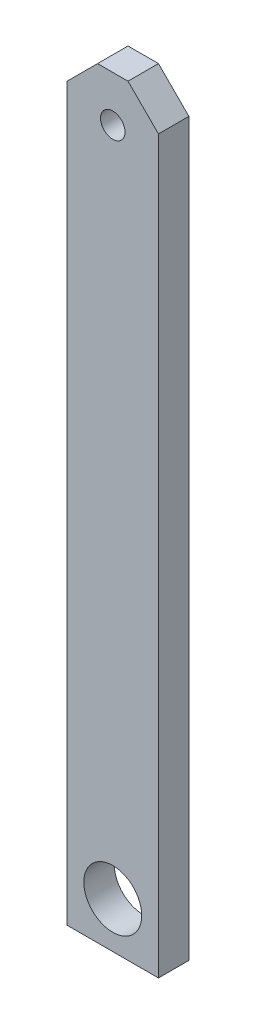
ISO-10303-21;
HEADER;
FILE_DESCRIPTION(('STEP AP214'),'2;1');
FILE_NAME('part.step','',(''),(''),'','','');
FILE_SCHEMA(('AUTOMOTIVE_DESIGN { 1 0 10303 214 1 1 1 1 }'));
ENDSEC;
DATA;
#1=APPLICATION_CONTEXT('core data for automotive mechanical design processes');
#2=APPLICATION_PROTOCOL_DEFINITION('international standard','automotive_design',2000,#1);
#3=PRODUCT_CONTEXT('',#1,'mechanical');
#4=PRODUCT('Part','Part','',(#3));
#5=PRODUCT_RELATED_PRODUCT_CATEGORY('part','',(#4));
#6=PRODUCT_DEFINITION_FORMATION('','',#4);
#7=PRODUCT_DEFINITION_CONTEXT('part definition',#1,'design');
#8=PRODUCT_DEFINITION('design','',#6,#7);
#9=PRODUCT_DEFINITION_SHAPE('','',#8);
#10=(LENGTH_UNIT() NAMED_UNIT(*) SI_UNIT(.MILLI.,.METRE.));
#11=(NAMED_UNIT(*) PLANE_ANGLE_UNIT() SI_UNIT($,.RADIAN.));
#12=(NAMED_UNIT(*) SI_UNIT($,.STERADIAN.) SOLID_ANGLE_UNIT());
#13=UNCERTAINTY_MEASURE_WITH_UNIT(LENGTH_MEASURE(1.E-05),#10,'distance_accuracy_value','');
#14=(GEOMETRIC_REPRESENTATION_CONTEXT(3) GLOBAL_UNCERTAINTY_ASSIGNED_CONTEXT((#13)) GLOBAL_UNIT_ASSIGNED_CONTEXT((#10,
#11,#12)) REPRESENTATION_CONTEXT('',''));
#15=CARTESIAN_POINT('',(0.,0.,0.));
#16=DIRECTION('',(0.,0.,1.));
#17=DIRECTION('',(1.,0.,0.));
#18=AXIS2_PLACEMENT_3D('',#15,#16,#17);
#19=CARTESIAN_POINT('',(0.,0.,6.35));
#20=DIRECTION('',(0.,0.,-1.));
#21=DIRECTION('',(-1.,0.,0.));
#22=AXIS2_PLACEMENT_3D('',#19,#20,#21);
#23=PLANE('',#22);
#24=DIRECTION('',(-1.,0.,0.));
#25=VECTOR('',#24,1.);
#26=CARTESIAN_POINT('',(0.,158.75,6.35));
#27=LINE('',#26,#25);
#28=CARTESIAN_POINT('',(12.7,158.75,6.35));
#29=VERTEX_POINT('',#28);
#30=CARTESIAN_POINT('',(6.35000000000003,158.75,6.35));
#31=VERTEX_POINT('',#30);
#32=EDGE_CURVE('E126',#29,#31,#27,.T.);
#33=ORIENTED_EDGE('',*,*,#32,.T.);
#34=DIRECTION('',(0.707106781186549,0.707106781186546,0.));
#35=VECTOR('',#34,1.);
#36=CARTESIAN_POINT('',(0.,152.4,6.35));
#37=LINE('',#36,#35);
#38=CARTESIAN_POINT('',(0.,152.4,6.35));
#39=VERTEX_POINT('',#38);
#40=EDGE_CURVE('E52',#31,#39,#37,.F.);
#41=ORIENTED_EDGE('',*,*,#40,.T.);
#42=DIRECTION('',(0.,-1.,0.));
#43=VECTOR('',#42,1.);
#44=CARTESIAN_POINT('',(0.,0.,6.35));
#45=LINE('',#44,#43);
#46=CARTESIAN_POINT('',(0.,0.,6.35));
#47=VERTEX_POINT('',#46);
#48=EDGE_CURVE('E98',#39,#47,#45,.T.);
#49=ORIENTED_EDGE('',*,*,#48,.T.);
#50=DIRECTION('',(1.,0.,0.));
#51=VECTOR('',#50,1.);
#52=CARTESIAN_POINT('',(0.,0.,6.35));
#53=LINE('',#52,#51);
#54=CARTESIAN_POINT('',(19.05,0.,6.35));
#55=VERTEX_POINT('',#54);
#56=EDGE_CURVE('E101',#47,#55,#53,.T.);
#57=ORIENTED_EDGE('',*,*,#56,.T.);
#58=DIRECTION('',(0.,1.,0.));
#59=VECTOR('',#58,1.);
#60=CARTESIAN_POINT('',(19.05,0.,6.35));
#61=LINE('',#60,#59);
#62=CARTESIAN_POINT('',(19.05,152.4,6.35));
#63=VERTEX_POINT('',#62);
#64=EDGE_CURVE('E116',#55,#63,#61,.T.);
#65=ORIENTED_EDGE('',*,*,#64,.T.);
#66=DIRECTION('',(0.707106781186545,-0.70710678118655,0.));
#67=VECTOR('',#66,1.);
#68=CARTESIAN_POINT('',(12.7,158.75,6.35));
#69=LINE('',#68,#67);
#70=EDGE_CURVE('E137',#63,#29,#69,.F.);
#71=ORIENTED_EDGE('',*,*,#70,.T.);
#72=EDGE_LOOP('',(#33,#41,#49,#57,#65,#71));
#73=FACE_BOUND('',#72,.T.);
#74=CARTESIAN_POINT('',(9.52499999999998,149.225,6.35));
#75=DIRECTION('',(0.,0.,1.));
#76=DIRECTION('',(1.,0.,0.));
#77=AXIS2_PLACEMENT_3D('',#74,#75,#76);
#78=CIRCLE('',#77,2.5527);
#79=CARTESIAN_POINT('',(12.0777,149.225,6.35));
#80=VERTEX_POINT('',#79);
#81=EDGE_CURVE('E158',#80,#80,#78,.T.);
#82=ORIENTED_EDGE('',*,*,#81,.F.);
#83=EDGE_LOOP('',(#82));
#84=FACE_BOUND('',#83,.T.);
#85=CARTESIAN_POINT('',(9.525,9.52499999999998,6.35));
#86=DIRECTION('',(0.,0.,1.));
#87=DIRECTION('',(1.,0.,0.));
#88=AXIS2_PLACEMENT_3D('',#85,#86,#87);
#89=CIRCLE('',#88,6.0325);
#90=CARTESIAN_POINT('',(15.5575,9.52499999999998,6.35));
#91=VERTEX_POINT('',#90);
#92=EDGE_CURVE('E164',#91,#91,#89,.T.);
#93=ORIENTED_EDGE('',*,*,#92,.F.);
#94=EDGE_LOOP('',(#93));
#95=FACE_BOUND('',#94,.T.);
#96=ADVANCED_FACE('F43',(#73,#84,#95),#23,.F.);
#97=CARTESIAN_POINT('',(0.,0.,6.35));
#98=DIRECTION('',(1.,0.,0.));
#99=DIRECTION('',(0.,1.,0.));
#100=AXIS2_PLACEMENT_3D('',#97,#98,#99);
#101=PLANE('',#100);
#102=ORIENTED_EDGE('',*,*,#48,.F.);
#103=DIRECTION('',(0.,0.,-1.));
#104=VECTOR('',#103,1.);
#105=CARTESIAN_POINT('',(0.,152.4,6.35));
#106=LINE('',#105,#104);
#107=CARTESIAN_POINT('',(0.,152.4,0.));
#108=VERTEX_POINT('',#107);
#109=EDGE_CURVE('E122',#39,#108,#106,.T.);
#110=ORIENTED_EDGE('',*,*,#109,.T.);
#111=DIRECTION('',(0.,-1.,0.));
#112=VECTOR('',#111,1.);
#113=CARTESIAN_POINT('',(0.,0.,0.));
#114=LINE('',#113,#112);
#115=CARTESIAN_POINT('',(0.,0.,0.));
#116=VERTEX_POINT('',#115);
#117=EDGE_CURVE('E120',#108,#116,#114,.T.);
#118=ORIENTED_EDGE('',*,*,#117,.T.);
#119=DIRECTION('',(0.,0.,-1.));
#120=VECTOR('',#119,1.);
#121=CARTESIAN_POINT('',(0.,0.,6.35));
#122=LINE('',#121,#120);
#123=EDGE_CURVE('E113',#47,#116,#122,.T.);
#124=ORIENTED_EDGE('',*,*,#123,.F.);
#125=EDGE_LOOP('',(#102,#110,#118,#124));
#126=FACE_BOUND('',#125,.T.);
#127=ADVANCED_FACE('F118',(#126),#101,.F.);
#128=CARTESIAN_POINT('',(0.,0.,6.35));
#129=DIRECTION('',(0.,1.,0.));
#130=DIRECTION('',(0.,0.,1.));
#131=AXIS2_PLACEMENT_3D('',#128,#129,#130);
#132=PLANE('',#131);
#133=DIRECTION('',(1.,0.,0.));
#134=VECTOR('',#133,1.);
#135=CARTESIAN_POINT('',(0.,0.,0.));
#136=LINE('',#135,#134);
#137=CARTESIAN_POINT('',(19.05,0.,0.));
#138=VERTEX_POINT('',#137);
#139=EDGE_CURVE('E149',#116,#138,#136,.T.);
#140=ORIENTED_EDGE('',*,*,#139,.T.);
#141=DIRECTION('',(0.,0.,-1.));
#142=VECTOR('',#141,1.);
#143=CARTESIAN_POINT('',(19.05,0.,6.35));
#144=LINE('',#143,#142);
#145=EDGE_CURVE('E115',#55,#138,#144,.T.);
#146=ORIENTED_EDGE('',*,*,#145,.F.);
#147=ORIENTED_EDGE('',*,*,#56,.F.);
#148=ORIENTED_EDGE('',*,*,#123,.T.);
#149=EDGE_LOOP('',(#140,#146,#147,#148));
#150=FACE_BOUND('',#149,.T.);
#151=ADVANCED_FACE('F112',(#150),#132,.F.);
#152=CARTESIAN_POINT('',(19.05,0.,6.35));
#153=DIRECTION('',(-1.,0.,0.));
#154=DIRECTION('',(0.,-1.,0.));
#155=AXIS2_PLACEMENT_3D('',#152,#153,#154);
#156=PLANE('',#155);
#157=DIRECTION('',(0.,1.,0.));
#158=VECTOR('',#157,1.);
#159=CARTESIAN_POINT('',(19.05,0.,0.));
#160=LINE('',#159,#158);
#161=CARTESIAN_POINT('',(19.05,152.4,0.));
#162=VERTEX_POINT('',#161);
#163=EDGE_CURVE('E147',#138,#162,#160,.T.);
#164=ORIENTED_EDGE('',*,*,#163,.T.);
#165=DIRECTION('',(0.,0.,1.));
#166=VECTOR('',#165,1.);
#167=CARTESIAN_POINT('',(19.05,152.4,6.35));
#168=LINE('',#167,#166);
#169=EDGE_CURVE('E11',#162,#63,#168,.T.);
#170=ORIENTED_EDGE('',*,*,#169,.T.);
#171=ORIENTED_EDGE('',*,*,#64,.F.);
#172=ORIENTED_EDGE('',*,*,#145,.T.);
#173=EDGE_LOOP('',(#164,#170,#171,#172));
#174=FACE_BOUND('',#173,.T.);
#175=ADVANCED_FACE('F148',(#174),#156,.F.);
#176=CARTESIAN_POINT('',(0.,158.75,6.35));
#177=DIRECTION('',(0.,-1.,0.));
#178=DIRECTION('',(0.,0.,-1.));
#179=AXIS2_PLACEMENT_3D('',#176,#177,#178);
#180=PLANE('',#179);
#181=DIRECTION('',(-1.,0.,0.));
#182=VECTOR('',#181,1.);
#183=CARTESIAN_POINT('',(0.,158.75,0.));
#184=LINE('',#183,#182);
#185=CARTESIAN_POINT('',(12.7,158.75,0.));
#186=VERTEX_POINT('',#185);
#187=CARTESIAN_POINT('',(6.35000000000003,158.75,0.));
#188=VERTEX_POINT('',#187);
#189=EDGE_CURVE('E108',#186,#188,#184,.T.);
#190=ORIENTED_EDGE('',*,*,#189,.T.);
#191=DIRECTION('',(0.,0.,1.));
#192=VECTOR('',#191,1.);
#193=CARTESIAN_POINT('',(6.35000000000003,158.75,6.35));
#194=LINE('',#193,#192);
#195=EDGE_CURVE('E65',#188,#31,#194,.T.);
#196=ORIENTED_EDGE('',*,*,#195,.T.);
#197=ORIENTED_EDGE('',*,*,#32,.F.);
#198=DIRECTION('',(0.,0.,-1.));
#199=VECTOR('',#198,1.);
#200=CARTESIAN_POINT('',(12.7,158.75,6.35));
#201=LINE('',#200,#199);
#202=EDGE_CURVE('E133',#29,#186,#201,.T.);
#203=ORIENTED_EDGE('',*,*,#202,.T.);
#204=EDGE_LOOP('',(#190,#196,#197,#203));
#205=FACE_BOUND('',#204,.T.);
#206=ADVANCED_FACE('F141',(#205),#180,.F.);
#207=CARTESIAN_POINT('',(0.,0.,0.));
#208=DIRECTION('',(0.,0.,-1.));
#209=DIRECTION('',(-1.,0.,0.));
#210=AXIS2_PLACEMENT_3D('',#207,#208,#209);
#211=PLANE('',#210);
#212=CARTESIAN_POINT('',(9.525,9.52499999999998,0.));
#213=DIRECTION('',(0.,0.,-1.));
#214=DIRECTION('',(-1.,0.,0.));
#215=AXIS2_PLACEMENT_3D('',#212,#213,#214);
#216=CIRCLE('',#215,6.0325);
#217=CARTESIAN_POINT('',(3.4925,9.52499999999998,0.));
#218=VERTEX_POINT('',#217);
#219=EDGE_CURVE('E161',#218,#218,#216,.T.);
#220=ORIENTED_EDGE('',*,*,#219,.F.);
#221=EDGE_LOOP('',(#220));
#222=FACE_BOUND('',#221,.T.);
#223=CARTESIAN_POINT('',(9.52499999999998,149.225,0.));
#224=DIRECTION('',(0.,0.,-1.));
#225=DIRECTION('',(-1.,0.,0.));
#226=AXIS2_PLACEMENT_3D('',#223,#224,#225);
#227=CIRCLE('',#226,2.5527);
#228=CARTESIAN_POINT('',(6.97229999999998,149.225,0.));
#229=VERTEX_POINT('',#228);
#230=EDGE_CURVE('E153',#229,#229,#227,.T.);
#231=ORIENTED_EDGE('',*,*,#230,.F.);
#232=EDGE_LOOP('',(#231));
#233=FACE_BOUND('',#232,.T.);
#234=ORIENTED_EDGE('',*,*,#117,.F.);
#235=DIRECTION('',(-0.707106781186549,-0.707106781186546,0.));
#236=VECTOR('',#235,1.);
#237=CARTESIAN_POINT('',(-76.2,76.2000000000003,0.));
#238=LINE('',#237,#236);
#239=EDGE_CURVE('E131',#108,#188,#238,.F.);
#240=ORIENTED_EDGE('',*,*,#239,.T.);
#241=ORIENTED_EDGE('',*,*,#189,.F.);
#242=DIRECTION('',(-0.707106781186545,0.70710678118655,0.));
#243=VECTOR('',#242,1.);
#244=CARTESIAN_POINT('',(85.725,85.7249999999995,0.));
#245=LINE('',#244,#243);
#246=EDGE_CURVE('E124',#186,#162,#245,.F.);
#247=ORIENTED_EDGE('',*,*,#246,.T.);
#248=ORIENTED_EDGE('',*,*,#163,.F.);
#249=ORIENTED_EDGE('',*,*,#139,.F.);
#250=EDGE_LOOP('',(#234,#240,#241,#247,#248,#249));
#251=FACE_BOUND('',#250,.T.);
#252=ADVANCED_FACE('F146',(#222,#233,#251),#211,.T.);
#253=CARTESIAN_POINT('',(9.52499999999998,149.225,6.35));
#254=DIRECTION('',(0.,0.,1.));
#255=DIRECTION('',(1.,0.,0.));
#256=AXIS2_PLACEMENT_3D('',#253,#254,#255);
#257=CYLINDRICAL_SURFACE('',#256,2.5527);
#258=ORIENTED_EDGE('',*,*,#81,.T.);
#259=EDGE_LOOP('',(#258));
#260=FACE_BOUND('',#259,.T.);
#261=ORIENTED_EDGE('',*,*,#230,.T.);
#262=EDGE_LOOP('',(#261));
#263=FACE_BOUND('',#262,.T.);
#264=ADVANCED_FACE('F179',(#260,#263),#257,.F.);
#265=CARTESIAN_POINT('',(9.525,9.52499999999998,6.35));
#266=DIRECTION('',(0.,0.,1.));
#267=DIRECTION('',(1.,0.,0.));
#268=AXIS2_PLACEMENT_3D('',#265,#266,#267);
#269=CYLINDRICAL_SURFACE('',#268,6.0325);
#270=ORIENTED_EDGE('',*,*,#92,.T.);
#271=EDGE_LOOP('',(#270));
#272=FACE_BOUND('',#271,.T.);
#273=ORIENTED_EDGE('',*,*,#219,.T.);
#274=EDGE_LOOP('',(#273));
#275=FACE_BOUND('',#274,.T.);
#276=ADVANCED_FACE('F168',(#272,#275),#269,.F.);
#277=CARTESIAN_POINT('',(0.,152.4,6.35));
#278=DIRECTION('',(0.707106781186546,-0.707106781186549,0.));
#279=DIRECTION('',(0.,0.,-1.));
#280=AXIS2_PLACEMENT_3D('',#277,#278,#279);
#281=PLANE('',#280);
#282=ORIENTED_EDGE('',*,*,#40,.F.);
#283=ORIENTED_EDGE('',*,*,#195,.F.);
#284=ORIENTED_EDGE('',*,*,#239,.F.);
#285=ORIENTED_EDGE('',*,*,#109,.F.);
#286=EDGE_LOOP('',(#282,#283,#284,#285));
#287=FACE_BOUND('',#286,.T.);
#288=ADVANCED_FACE('F190',(#287),#281,.F.);
#289=CARTESIAN_POINT('',(12.7,158.75,6.35));
#290=DIRECTION('',(-0.70710678118655,-0.707106781186545,0.));
#291=DIRECTION('',(0.,0.,-1.));
#292=AXIS2_PLACEMENT_3D('',#289,#290,#291);
#293=PLANE('',#292);
#294=ORIENTED_EDGE('',*,*,#70,.F.);
#295=ORIENTED_EDGE('',*,*,#169,.F.);
#296=ORIENTED_EDGE('',*,*,#246,.F.);
#297=ORIENTED_EDGE('',*,*,#202,.F.);
#298=EDGE_LOOP('',(#294,#295,#296,#297));
#299=FACE_BOUND('',#298,.T.);
#300=ADVANCED_FACE('F46',(#299),#293,.F.);
#301=CLOSED_SHELL('',(#96,#127,#151,#175,#206,#252,#264,#276,#288,#300));
#302=MANIFOLD_SOLID_BREP('B2',#301);
#303=ADVANCED_BREP_SHAPE_REPRESENTATION('',(#18,#302),#14);
#304=SHAPE_DEFINITION_REPRESENTATION(#9,#303);
ENDSEC;
END-ISO-10303-21;
